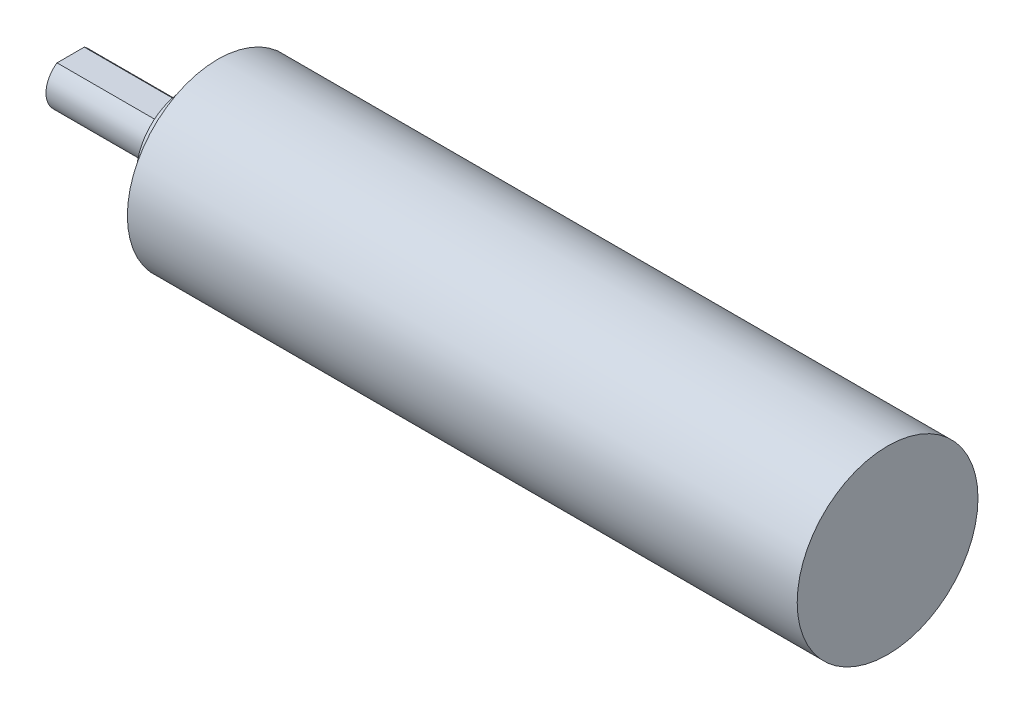
ISO-10303-21;
HEADER;
FILE_DESCRIPTION(('STEP AP214'),'2;1');
FILE_NAME('part.step','',(''),(''),'','','');
FILE_SCHEMA(('AUTOMOTIVE_DESIGN { 1 0 10303 214 1 1 1 1 }'));
ENDSEC;
DATA;
#1=APPLICATION_CONTEXT('core data for automotive mechanical design processes');
#2=APPLICATION_PROTOCOL_DEFINITION('international standard','automotive_design',2000,#1);
#3=PRODUCT_CONTEXT('',#1,'mechanical');
#4=PRODUCT('Part','Part','',(#3));
#5=PRODUCT_RELATED_PRODUCT_CATEGORY('part','',(#4));
#6=PRODUCT_DEFINITION_FORMATION('','',#4);
#7=PRODUCT_DEFINITION_CONTEXT('part definition',#1,'design');
#8=PRODUCT_DEFINITION('design','',#6,#7);
#9=PRODUCT_DEFINITION_SHAPE('','',#8);
#10=(LENGTH_UNIT() NAMED_UNIT(*) SI_UNIT(.MILLI.,.METRE.));
#11=(NAMED_UNIT(*) PLANE_ANGLE_UNIT() SI_UNIT($,.RADIAN.));
#12=(NAMED_UNIT(*) SI_UNIT($,.STERADIAN.) SOLID_ANGLE_UNIT());
#13=UNCERTAINTY_MEASURE_WITH_UNIT(LENGTH_MEASURE(1.E-05),#10,'distance_accuracy_value','');
#14=(GEOMETRIC_REPRESENTATION_CONTEXT(3) GLOBAL_UNCERTAINTY_ASSIGNED_CONTEXT((#13)) GLOBAL_UNIT_ASSIGNED_CONTEXT((#10,
#11,#12)) REPRESENTATION_CONTEXT('',''));
#15=CARTESIAN_POINT('',(0.,0.,0.));
#16=DIRECTION('',(0.,0.,1.));
#17=DIRECTION('',(1.,0.,0.));
#18=AXIS2_PLACEMENT_3D('',#15,#16,#17);
#19=CARTESIAN_POINT('',(0.,0.,0.));
#20=DIRECTION('',(1.,0.,0.));
#21=DIRECTION('',(0.,0.,-1.));
#22=AXIS2_PLACEMENT_3D('',#19,#20,#21);
#23=PLANE('',#22);
#24=CARTESIAN_POINT('',(0.,0.,0.));
#25=DIRECTION('',(-1.,0.,0.));
#26=DIRECTION('',(0.,0.,1.));
#27=AXIS2_PLACEMENT_3D('',#24,#25,#26);
#28=CIRCLE('',#27,3.);
#29=CARTESIAN_POINT('',(0.,2.5,-1.6583123951777));
#30=VERTEX_POINT('',#29);
#31=CARTESIAN_POINT('',(0.,2.5,1.6583123951777));
#32=VERTEX_POINT('',#31);
#33=EDGE_CURVE('E11',#30,#32,#28,.T.);
#34=ORIENTED_EDGE('',*,*,#33,.T.);
#35=DIRECTION('',(0.,0.,1.));
#36=VECTOR('',#35,1.);
#37=CARTESIAN_POINT('',(0.,2.5,-1.6583123951777));
#38=LINE('',#37,#36);
#39=EDGE_CURVE('E81',#30,#32,#38,.T.);
#40=ORIENTED_EDGE('',*,*,#39,.F.);
#41=EDGE_LOOP('',(#34,#40));
#42=FACE_BOUND('',#41,.T.);
#43=ADVANCED_FACE('F39',(#42),#23,.F.);
#44=CARTESIAN_POINT('',(0.,0.,0.));
#45=DIRECTION('',(-1.,0.,0.));
#46=DIRECTION('',(0.,0.,1.));
#47=AXIS2_PLACEMENT_3D('',#44,#45,#46);
#48=CYLINDRICAL_SURFACE('',#47,3.);
#49=CARTESIAN_POINT('',(14.,0.,0.));
#50=DIRECTION('',(-1.,0.,0.));
#51=DIRECTION('',(0.,0.,1.));
#52=AXIS2_PLACEMENT_3D('',#49,#50,#51);
#53=CIRCLE('',#52,3.);
#54=CARTESIAN_POINT('',(14.,2.5,-1.6583123951777));
#55=VERTEX_POINT('',#54);
#56=CARTESIAN_POINT('',(14.,2.5,1.6583123951777));
#57=VERTEX_POINT('',#56);
#58=EDGE_CURVE('E46',#55,#57,#53,.T.);
#59=ORIENTED_EDGE('',*,*,#58,.T.);
#60=DIRECTION('',(-1.,0.,0.));
#61=VECTOR('',#60,1.);
#62=CARTESIAN_POINT('',(14.,2.5,1.6583123951777));
#63=LINE('',#62,#61);
#64=EDGE_CURVE('E79',#57,#32,#63,.T.);
#65=ORIENTED_EDGE('',*,*,#64,.T.);
#66=ORIENTED_EDGE('',*,*,#33,.F.);
#67=DIRECTION('',(-1.,0.,0.));
#68=VECTOR('',#67,1.);
#69=CARTESIAN_POINT('',(14.,2.5,-1.6583123951777));
#70=LINE('',#69,#68);
#71=EDGE_CURVE('E76',#55,#30,#70,.T.);
#72=ORIENTED_EDGE('',*,*,#71,.F.);
#73=EDGE_LOOP('',(#59,#65,#66,#72));
#74=FACE_BOUND('',#73,.T.);
#75=ADVANCED_FACE('F85',(#74),#48,.T.);
#76=CARTESIAN_POINT('',(14.,3.,0.));
#77=DIRECTION('',(1.,0.,0.));
#78=DIRECTION('',(0.,0.,-1.));
#79=AXIS2_PLACEMENT_3D('',#76,#77,#78);
#80=PLANE('',#79);
#81=ORIENTED_EDGE('',*,*,#58,.F.);
#82=DIRECTION('',(0.,0.,1.));
#83=VECTOR('',#82,1.);
#84=CARTESIAN_POINT('',(14.,2.5,-1.6583123951777));
#85=LINE('',#84,#83);
#86=EDGE_CURVE('E52',#55,#57,#85,.T.);
#87=ORIENTED_EDGE('',*,*,#86,.T.);
#88=EDGE_LOOP('',(#81,#87));
#89=FACE_BOUND('',#88,.T.);
#90=CARTESIAN_POINT('',(14.,0.,0.));
#91=DIRECTION('',(-1.,0.,0.));
#92=DIRECTION('',(0.,0.,1.));
#93=AXIS2_PLACEMENT_3D('',#90,#91,#92);
#94=CIRCLE('',#93,6.);
#95=CARTESIAN_POINT('',(14.,0.,6.));
#96=VERTEX_POINT('',#95);
#97=EDGE_CURVE('E89',#96,#96,#94,.T.);
#98=ORIENTED_EDGE('',*,*,#97,.T.);
#99=EDGE_LOOP('',(#98));
#100=FACE_BOUND('',#99,.T.);
#101=ADVANCED_FACE('F87',(#89,#100),#80,.F.);
#102=CARTESIAN_POINT('',(0.,0.,0.));
#103=DIRECTION('',(-1.,0.,0.));
#104=DIRECTION('',(0.,0.,1.));
#105=AXIS2_PLACEMENT_3D('',#102,#103,#104);
#106=CYLINDRICAL_SURFACE('',#105,6.);
#107=ORIENTED_EDGE('',*,*,#97,.F.);
#108=EDGE_LOOP('',(#107));
#109=FACE_BOUND('',#108,.T.);
#110=CARTESIAN_POINT('',(17.9,0.,0.));
#111=DIRECTION('',(-1.,0.,0.));
#112=DIRECTION('',(0.,0.,1.));
#113=AXIS2_PLACEMENT_3D('',#110,#111,#112);
#114=CIRCLE('',#113,6.);
#115=CARTESIAN_POINT('',(17.9,0.,6.));
#116=VERTEX_POINT('',#115);
#117=EDGE_CURVE('E91',#116,#116,#114,.T.);
#118=ORIENTED_EDGE('',*,*,#117,.T.);
#119=EDGE_LOOP('',(#118));
#120=FACE_BOUND('',#119,.T.);
#121=ADVANCED_FACE('F137',(#109,#120),#106,.T.);
#122=CARTESIAN_POINT('',(17.9,6.,0.));
#123=DIRECTION('',(1.,0.,0.));
#124=DIRECTION('',(0.,0.,-1.));
#125=AXIS2_PLACEMENT_3D('',#122,#123,#124);
#126=PLANE('',#125);
#127=CARTESIAN_POINT('',(17.9,9.,0.));
#128=DIRECTION('',(-1.,0.,0.));
#129=DIRECTION('',(0.,0.,1.));
#130=AXIS2_PLACEMENT_3D('',#127,#128,#129);
#131=CIRCLE('',#130,1.24999999999999);
#132=CARTESIAN_POINT('',(17.9,9.,1.24999999999999));
#133=VERTEX_POINT('',#132);
#134=EDGE_CURVE('E123',#133,#133,#131,.T.);
#135=ORIENTED_EDGE('',*,*,#134,.F.);
#136=EDGE_LOOP('',(#135));
#137=FACE_BOUND('',#136,.T.);
#138=CARTESIAN_POINT('',(17.9,0.,9.));
#139=DIRECTION('',(-1.,0.,0.));
#140=DIRECTION('',(0.,0.,1.));
#141=AXIS2_PLACEMENT_3D('',#138,#139,#140);
#142=CIRCLE('',#141,1.24999999999999);
#143=CARTESIAN_POINT('',(17.9,0.,10.25));
#144=VERTEX_POINT('',#143);
#145=EDGE_CURVE('E117',#144,#144,#142,.T.);
#146=ORIENTED_EDGE('',*,*,#145,.F.);
#147=EDGE_LOOP('',(#146));
#148=FACE_BOUND('',#147,.T.);
#149=CARTESIAN_POINT('',(17.9,-9.,0.));
#150=DIRECTION('',(-1.,0.,0.));
#151=DIRECTION('',(0.,0.,1.));
#152=AXIS2_PLACEMENT_3D('',#149,#150,#151);
#153=CIRCLE('',#152,1.24999999999999);
#154=CARTESIAN_POINT('',(17.9,-9.,1.24999999999999));
#155=VERTEX_POINT('',#154);
#156=EDGE_CURVE('E111',#155,#155,#153,.T.);
#157=ORIENTED_EDGE('',*,*,#156,.F.);
#158=EDGE_LOOP('',(#157));
#159=FACE_BOUND('',#158,.T.);
#160=CARTESIAN_POINT('',(17.9,0.,-9.));
#161=DIRECTION('',(-1.,0.,0.));
#162=DIRECTION('',(0.,0.,1.));
#163=AXIS2_PLACEMENT_3D('',#160,#161,#162);
#164=CIRCLE('',#163,1.24999999999999);
#165=CARTESIAN_POINT('',(17.9,0.,-7.75000000000001));
#166=VERTEX_POINT('',#165);
#167=EDGE_CURVE('E105',#166,#166,#164,.T.);
#168=ORIENTED_EDGE('',*,*,#167,.F.);
#169=EDGE_LOOP('',(#168));
#170=FACE_BOUND('',#169,.T.);
#171=ORIENTED_EDGE('',*,*,#117,.F.);
#172=EDGE_LOOP('',(#171));
#173=FACE_BOUND('',#172,.T.);
#174=CARTESIAN_POINT('',(17.9,0.,0.));
#175=DIRECTION('',(-1.,0.,0.));
#176=DIRECTION('',(0.,0.,1.));
#177=AXIS2_PLACEMENT_3D('',#174,#175,#176);
#178=CIRCLE('',#177,11.);
#179=CARTESIAN_POINT('',(17.9,0.,11.));
#180=VERTEX_POINT('',#179);
#181=EDGE_CURVE('E96',#180,#180,#178,.T.);
#182=ORIENTED_EDGE('',*,*,#181,.T.);
#183=EDGE_LOOP('',(#182));
#184=FACE_BOUND('',#183,.T.);
#185=ADVANCED_FACE('F142',(#137,#148,#159,#170,#173,#184),#126,.F.);
#186=CARTESIAN_POINT('',(0.,0.,0.));
#187=DIRECTION('',(-1.,0.,0.));
#188=DIRECTION('',(0.,0.,1.));
#189=AXIS2_PLACEMENT_3D('',#186,#187,#188);
#190=CYLINDRICAL_SURFACE('',#189,11.);
#191=ORIENTED_EDGE('',*,*,#181,.F.);
#192=EDGE_LOOP('',(#191));
#193=FACE_BOUND('',#192,.T.);
#194=CARTESIAN_POINT('',(99.4,0.,0.));
#195=DIRECTION('',(-1.,0.,0.));
#196=DIRECTION('',(0.,0.,1.));
#197=AXIS2_PLACEMENT_3D('',#194,#195,#196);
#198=CIRCLE('',#197,11.);
#199=CARTESIAN_POINT('',(99.4,0.,11.));
#200=VERTEX_POINT('',#199);
#201=EDGE_CURVE('E99',#200,#200,#198,.T.);
#202=ORIENTED_EDGE('',*,*,#201,.T.);
#203=EDGE_LOOP('',(#202));
#204=FACE_BOUND('',#203,.T.);
#205=ADVANCED_FACE('F146',(#193,#204),#190,.T.);
#206=CARTESIAN_POINT('',(99.4,11.,0.));
#207=DIRECTION('',(-1.,0.,0.));
#208=DIRECTION('',(0.,0.,1.));
#209=AXIS2_PLACEMENT_3D('',#206,#207,#208);
#210=PLANE('',#209);
#211=ORIENTED_EDGE('',*,*,#201,.F.);
#212=EDGE_LOOP('',(#211));
#213=FACE_BOUND('',#212,.T.);
#214=ADVANCED_FACE('F150',(#213),#210,.F.);
#215=CARTESIAN_POINT('',(25.4,0.,-9.));
#216=DIRECTION('',(-1.,0.,0.));
#217=DIRECTION('',(0.,0.,1.));
#218=AXIS2_PLACEMENT_3D('',#215,#216,#217);
#219=CONICAL_SURFACE('',#218,1.24999999999999,1.02974425867665);
#220=CARTESIAN_POINT('',(26.1510757737844,0.,-9.));
#221=VERTEX_POINT('',#220);
#222=VERTEX_LOOP('',#221);
#223=FACE_BOUND('',#222,.T.);
#224=CARTESIAN_POINT('',(25.4,0.,-9.));
#225=DIRECTION('',(-1.,0.,0.));
#226=DIRECTION('',(0.,0.,1.));
#227=AXIS2_PLACEMENT_3D('',#224,#225,#226);
#228=CIRCLE('',#227,1.24999999999999);
#229=CARTESIAN_POINT('',(25.4,0.,-7.75000000000001));
#230=VERTEX_POINT('',#229);
#231=EDGE_CURVE('E102',#230,#230,#228,.T.);
#232=ORIENTED_EDGE('',*,*,#231,.T.);
#233=EDGE_LOOP('',(#232));
#234=FACE_BOUND('',#233,.T.);
#235=ADVANCED_FACE('F154',(#223,#234),#219,.F.);
#236=CARTESIAN_POINT('',(17.9,0.,-9.));
#237=DIRECTION('',(-1.,0.,0.));
#238=DIRECTION('',(0.,0.,1.));
#239=AXIS2_PLACEMENT_3D('',#236,#237,#238);
#240=CYLINDRICAL_SURFACE('',#239,1.24999999999999);
#241=ORIENTED_EDGE('',*,*,#231,.F.);
#242=EDGE_LOOP('',(#241));
#243=FACE_BOUND('',#242,.T.);
#244=ORIENTED_EDGE('',*,*,#167,.T.);
#245=EDGE_LOOP('',(#244));
#246=FACE_BOUND('',#245,.T.);
#247=ADVANCED_FACE('F158',(#243,#246),#240,.F.);
#248=CARTESIAN_POINT('',(25.4,-9.,0.));
#249=DIRECTION('',(-1.,0.,0.));
#250=DIRECTION('',(0.,0.,1.));
#251=AXIS2_PLACEMENT_3D('',#248,#249,#250);
#252=CONICAL_SURFACE('',#251,1.24999999999999,1.02974425867665);
#253=CARTESIAN_POINT('',(26.1510757737844,-9.,0.));
#254=VERTEX_POINT('',#253);
#255=VERTEX_LOOP('',#254);
#256=FACE_BOUND('',#255,.T.);
#257=CARTESIAN_POINT('',(25.4,-9.,0.));
#258=DIRECTION('',(-1.,0.,0.));
#259=DIRECTION('',(0.,0.,1.));
#260=AXIS2_PLACEMENT_3D('',#257,#258,#259);
#261=CIRCLE('',#260,1.24999999999999);
#262=CARTESIAN_POINT('',(25.4,-9.,1.24999999999999));
#263=VERTEX_POINT('',#262);
#264=EDGE_CURVE('E108',#263,#263,#261,.T.);
#265=ORIENTED_EDGE('',*,*,#264,.T.);
#266=EDGE_LOOP('',(#265));
#267=FACE_BOUND('',#266,.T.);
#268=ADVANCED_FACE('F161',(#256,#267),#252,.F.);
#269=CARTESIAN_POINT('',(17.9,-9.,0.));
#270=DIRECTION('',(-1.,0.,0.));
#271=DIRECTION('',(0.,0.,1.));
#272=AXIS2_PLACEMENT_3D('',#269,#270,#271);
#273=CYLINDRICAL_SURFACE('',#272,1.24999999999999);
#274=ORIENTED_EDGE('',*,*,#264,.F.);
#275=EDGE_LOOP('',(#274));
#276=FACE_BOUND('',#275,.T.);
#277=ORIENTED_EDGE('',*,*,#156,.T.);
#278=EDGE_LOOP('',(#277));
#279=FACE_BOUND('',#278,.T.);
#280=ADVANCED_FACE('F165',(#276,#279),#273,.F.);
#281=CARTESIAN_POINT('',(25.4,0.,9.));
#282=DIRECTION('',(-1.,0.,0.));
#283=DIRECTION('',(0.,0.,1.));
#284=AXIS2_PLACEMENT_3D('',#281,#282,#283);
#285=CONICAL_SURFACE('',#284,1.24999999999999,1.02974425867665);
#286=CARTESIAN_POINT('',(26.1510757737844,0.,9.));
#287=VERTEX_POINT('',#286);
#288=VERTEX_LOOP('',#287);
#289=FACE_BOUND('',#288,.T.);
#290=CARTESIAN_POINT('',(25.4,0.,9.));
#291=DIRECTION('',(-1.,0.,0.));
#292=DIRECTION('',(0.,0.,1.));
#293=AXIS2_PLACEMENT_3D('',#290,#291,#292);
#294=CIRCLE('',#293,1.24999999999999);
#295=CARTESIAN_POINT('',(25.4,0.,10.25));
#296=VERTEX_POINT('',#295);
#297=EDGE_CURVE('E114',#296,#296,#294,.T.);
#298=ORIENTED_EDGE('',*,*,#297,.T.);
#299=EDGE_LOOP('',(#298));
#300=FACE_BOUND('',#299,.T.);
#301=ADVANCED_FACE('F169',(#289,#300),#285,.F.);
#302=CARTESIAN_POINT('',(17.9,0.,9.));
#303=DIRECTION('',(-1.,0.,0.));
#304=DIRECTION('',(0.,0.,1.));
#305=AXIS2_PLACEMENT_3D('',#302,#303,#304);
#306=CYLINDRICAL_SURFACE('',#305,1.24999999999999);
#307=ORIENTED_EDGE('',*,*,#297,.F.);
#308=EDGE_LOOP('',(#307));
#309=FACE_BOUND('',#308,.T.);
#310=ORIENTED_EDGE('',*,*,#145,.T.);
#311=EDGE_LOOP('',(#310));
#312=FACE_BOUND('',#311,.T.);
#313=ADVANCED_FACE('F173',(#309,#312),#306,.F.);
#314=CARTESIAN_POINT('',(25.4,9.,0.));
#315=DIRECTION('',(-1.,0.,0.));
#316=DIRECTION('',(0.,0.,1.));
#317=AXIS2_PLACEMENT_3D('',#314,#315,#316);
#318=CONICAL_SURFACE('',#317,1.24999999999999,1.02974425867665);
#319=CARTESIAN_POINT('',(26.1510757737844,9.,0.));
#320=VERTEX_POINT('',#319);
#321=VERTEX_LOOP('',#320);
#322=FACE_BOUND('',#321,.T.);
#323=CARTESIAN_POINT('',(25.4,9.,0.));
#324=DIRECTION('',(-1.,0.,0.));
#325=DIRECTION('',(0.,0.,1.));
#326=AXIS2_PLACEMENT_3D('',#323,#324,#325);
#327=CIRCLE('',#326,1.24999999999999);
#328=CARTESIAN_POINT('',(25.4,9.,1.24999999999999));
#329=VERTEX_POINT('',#328);
#330=EDGE_CURVE('E120',#329,#329,#327,.T.);
#331=ORIENTED_EDGE('',*,*,#330,.T.);
#332=EDGE_LOOP('',(#331));
#333=FACE_BOUND('',#332,.T.);
#334=ADVANCED_FACE('F177',(#322,#333),#318,.F.);
#335=CARTESIAN_POINT('',(17.9,9.,0.));
#336=DIRECTION('',(-1.,0.,0.));
#337=DIRECTION('',(0.,0.,1.));
#338=AXIS2_PLACEMENT_3D('',#335,#336,#337);
#339=CYLINDRICAL_SURFACE('',#338,1.24999999999999);
#340=ORIENTED_EDGE('',*,*,#330,.F.);
#341=EDGE_LOOP('',(#340));
#342=FACE_BOUND('',#341,.T.);
#343=ORIENTED_EDGE('',*,*,#134,.T.);
#344=EDGE_LOOP('',(#343));
#345=FACE_BOUND('',#344,.T.);
#346=ADVANCED_FACE('F181',(#342,#345),#339,.F.);
#347=CARTESIAN_POINT('',(14.,2.5,-1.6583123951777));
#348=DIRECTION('',(0.,-1.,0.));
#349=DIRECTION('',(0.,0.,-1.));
#350=AXIS2_PLACEMENT_3D('',#347,#348,#349);
#351=PLANE('',#350);
#352=ORIENTED_EDGE('',*,*,#39,.T.);
#353=ORIENTED_EDGE('',*,*,#64,.F.);
#354=ORIENTED_EDGE('',*,*,#86,.F.);
#355=ORIENTED_EDGE('',*,*,#71,.T.);
#356=EDGE_LOOP('',(#352,#353,#354,#355));
#357=FACE_BOUND('',#356,.T.);
#358=ADVANCED_FACE('F75',(#357),#351,.F.);
#359=CLOSED_SHELL('',(#43,#75,#101,#121,#185,#205,#214,#235,#247,#268,#280,#301,#313,#334,#346,#358));
#360=MANIFOLD_SOLID_BREP('B2',#359);
#361=ADVANCED_BREP_SHAPE_REPRESENTATION('',(#18,#360),#14);
#362=SHAPE_DEFINITION_REPRESENTATION(#9,#361);
ENDSEC;
END-ISO-10303-21;
